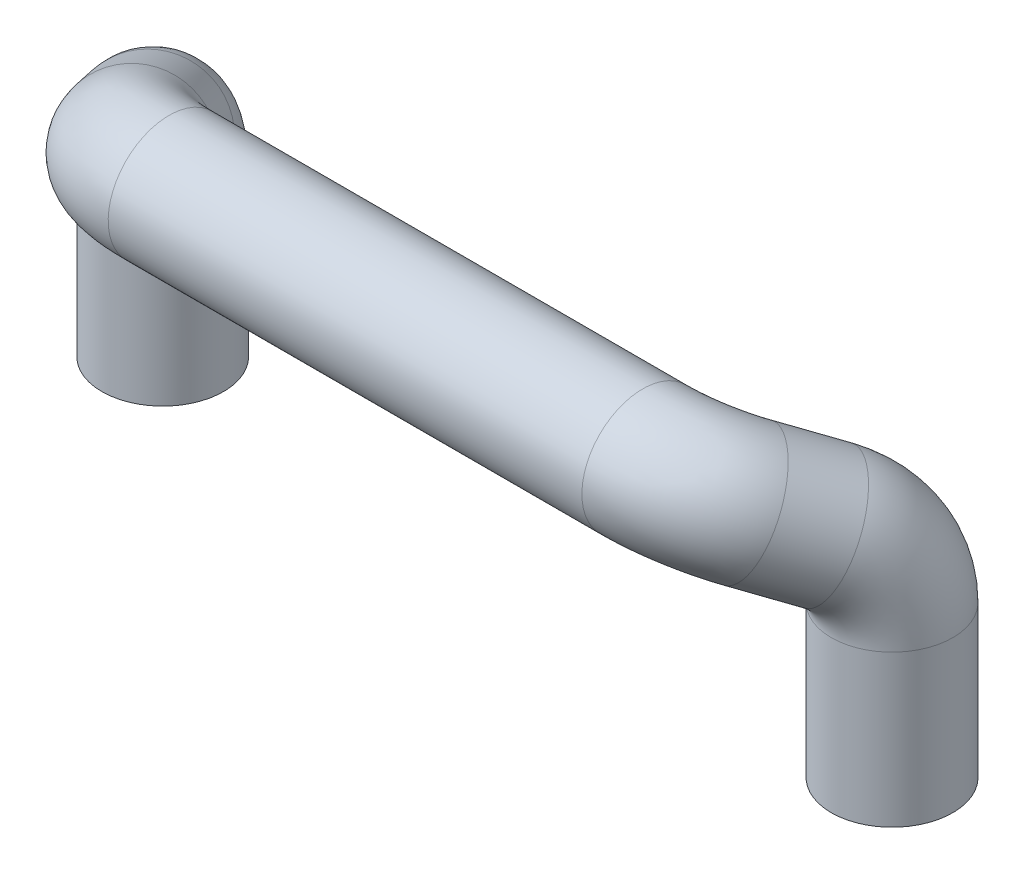
ISO-10303-21;
HEADER;
FILE_DESCRIPTION(('STEP AP214'),'2;1');
FILE_NAME('part.step','',(''),(''),'','','');
FILE_SCHEMA(('AUTOMOTIVE_DESIGN { 1 0 10303 214 1 1 1 1 }'));
ENDSEC;
DATA;
#1=APPLICATION_CONTEXT('core data for automotive mechanical design processes');
#2=APPLICATION_PROTOCOL_DEFINITION('international standard','automotive_design',2000,#1);
#3=PRODUCT_CONTEXT('',#1,'mechanical');
#4=PRODUCT('Part','Part','',(#3));
#5=PRODUCT_RELATED_PRODUCT_CATEGORY('part','',(#4));
#6=PRODUCT_DEFINITION_FORMATION('','',#4);
#7=PRODUCT_DEFINITION_CONTEXT('part definition',#1,'design');
#8=PRODUCT_DEFINITION('design','',#6,#7);
#9=PRODUCT_DEFINITION_SHAPE('','',#8);
#10=(LENGTH_UNIT() NAMED_UNIT(*) SI_UNIT(.MILLI.,.METRE.));
#11=(NAMED_UNIT(*) PLANE_ANGLE_UNIT() SI_UNIT($,.RADIAN.));
#12=(NAMED_UNIT(*) SI_UNIT($,.STERADIAN.) SOLID_ANGLE_UNIT());
#13=UNCERTAINTY_MEASURE_WITH_UNIT(LENGTH_MEASURE(1.E-05),#10,'distance_accuracy_value','');
#14=(GEOMETRIC_REPRESENTATION_CONTEXT(3) GLOBAL_UNCERTAINTY_ASSIGNED_CONTEXT((#13)) GLOBAL_UNIT_ASSIGNED_CONTEXT((#10,
#11,#12)) REPRESENTATION_CONTEXT('',''));
#15=CARTESIAN_POINT('',(0.,0.,0.));
#16=DIRECTION('',(0.,0.,1.));
#17=DIRECTION('',(1.,0.,0.));
#18=AXIS2_PLACEMENT_3D('',#15,#16,#17);
#19=CARTESIAN_POINT('',(65.,-25.,0.));
#20=DIRECTION('',(0.,-1.,0.));
#21=DIRECTION('',(0.,0.,1.));
#22=AXIS2_PLACEMENT_3D('',#19,#20,#21);
#23=PLANE('',#22);
#24=CARTESIAN_POINT('',(65.,-25.,0.));
#25=DIRECTION('',(0.,-1.,0.));
#26=DIRECTION('',(0.,0.,1.));
#27=AXIS2_PLACEMENT_3D('',#24,#25,#26);
#28=CIRCLE('',#27,7.5);
#29=CARTESIAN_POINT('',(65.,-25.,7.49999999999999));
#30=VERTEX_POINT('',#29);
#31=EDGE_CURVE('E80',#30,#30,#28,.T.);
#32=ORIENTED_EDGE('',*,*,#31,.T.);
#33=EDGE_LOOP('',(#32));
#34=FACE_BOUND('',#33,.T.);
#35=ADVANCED_FACE('F46',(#34),#23,.T.);
#36=CARTESIAN_POINT('',(-25.,-25.,0.));
#37=DIRECTION('',(0.,1.,0.));
#38=DIRECTION('',(0.,0.,1.));
#39=AXIS2_PLACEMENT_3D('',#36,#37,#38);
#40=PLANE('',#39);
#41=CARTESIAN_POINT('',(-25.,-25.,0.));
#42=DIRECTION('',(0.,1.,0.));
#43=DIRECTION('',(0.,0.,1.));
#44=AXIS2_PLACEMENT_3D('',#41,#42,#43);
#45=CIRCLE('',#44,7.5);
#46=CARTESIAN_POINT('',(-25.,-25.,7.49999999999999));
#47=VERTEX_POINT('',#46);
#48=EDGE_CURVE('E11',#47,#47,#45,.T.);
#49=ORIENTED_EDGE('',*,*,#48,.F.);
#50=EDGE_LOOP('',(#49));
#51=FACE_BOUND('',#50,.T.);
#52=ADVANCED_FACE('F88',(#51),#40,.F.);
#53=CARTESIAN_POINT('',(65.,-25.,0.));
#54=DIRECTION('',(0.,1.,0.));
#55=DIRECTION('',(0.,0.,1.));
#56=AXIS2_PLACEMENT_3D('',#53,#54,#55);
#57=CYLINDRICAL_SURFACE('',#56,7.5);
#58=CARTESIAN_POINT('',(65.,-6.29015931035198,0.));
#59=DIRECTION('',(0.,-1.,0.));
#60=DIRECTION('',(0.,0.,1.));
#61=AXIS2_PLACEMENT_3D('',#58,#59,#60);
#62=CIRCLE('',#61,7.5);
#63=CARTESIAN_POINT('',(69.1602514716892,-6.29015931035198,-6.24037720753386));
#64=VERTEX_POINT('',#63);
#65=EDGE_CURVE('E77',#64,#64,#62,.T.);
#66=ORIENTED_EDGE('',*,*,#65,.T.);
#67=EDGE_LOOP('',(#66));
#68=FACE_BOUND('',#67,.T.);
#69=ORIENTED_EDGE('',*,*,#31,.F.);
#70=EDGE_LOOP('',(#69));
#71=FACE_BOUND('',#70,.T.);
#72=ADVANCED_FACE('F85',(#68,#71),#57,.T.);
#73=CARTESIAN_POINT('',(59.4529980377478,-6.29015931035198,8.32050294337845));
#74=DIRECTION('',(0.832050294337845,0.,0.554700196225228));
#75=DIRECTION('',(0.554700196225228,0.,-0.832050294337845));
#76=AXIS2_PLACEMENT_3D('',#73,#74,#75);
#77=TOROIDAL_SURFACE('',#76,10.,7.5);
#78=CARTESIAN_POINT('',(61.854920344824,2.723718878308,4.717619482764));
#79=DIRECTION('',(0.499999999999999,-0.433012701892218,-0.750000000000001));
#80=DIRECTION('',(0.261686445280513,-0.750000000000002,0.607470332079227));
#81=AXIS2_PLACEMENT_3D('',#78,#79,#80);
#82=CIRCLE('',#81,7.5);
#83=CARTESIAN_POINT('',(63.6563620751313,9.48412751980299,2.01545688730315));
#84=VERTEX_POINT('',#83);
#85=EDGE_CURVE('E74',#84,#84,#82,.T.);
#86=CARTESIAN_POINT('',(59.4529980377478,-6.29015931035198,8.32050294337845));
#87=DIRECTION('',(0.832050294337845,0.,0.554700196225228));
#88=DIRECTION('',(0.554700196225228,0.,-0.832050294337845));
#89=AXIS2_PLACEMENT_3D('',#86,#87,#88);
#90=CIRCLE('',#89,17.5);
#91=EDGE_CURVE('',#64,#84,#90,.T.);
#92=ORIENTED_EDGE('',*,*,#65,.F.);
#93=ORIENTED_EDGE('',*,*,#85,.T.);
#94=ORIENTED_EDGE('',*,*,#91,.T.);
#95=ORIENTED_EDGE('',*,*,#91,.F.);
#96=EDGE_LOOP('',(#92,#94,#93,#95));
#97=FACE_BOUND('',#96,.T.);
#98=ADVANCED_FACE('F87',(#97),#77,.T.);
#99=CARTESIAN_POINT('',(61.854920344824,2.723718878308,4.71761948276399));
#100=DIRECTION('',(-0.499999999999999,0.433012701892218,0.750000000000001));
#101=DIRECTION('',(0.832050294337844,0.,0.554700196225228));
#102=AXIS2_PLACEMENT_3D('',#99,#100,#101);
#103=CYLINDRICAL_SURFACE('',#102,7.5);
#104=CARTESIAN_POINT('',(57.8867513459481,6.16025403784441,10.6698729810779));
#105=DIRECTION('',(0.499999999999999,-0.433012701892218,-0.750000000000001));
#106=DIRECTION('',(0.261686445280513,-0.750000000000002,0.607470332079226));
#107=AXIS2_PLACEMENT_3D('',#104,#105,#106);
#108=CIRCLE('',#107,7.5);
#109=CARTESIAN_POINT('',(64.3819418743314,8.03525403784439,13.9174682452695));
#110=VERTEX_POINT('',#109);
#111=EDGE_CURVE('E71',#110,#110,#108,.T.);
#112=ORIENTED_EDGE('',*,*,#111,.T.);
#113=EDGE_LOOP('',(#112));
#114=FACE_BOUND('',#113,.T.);
#115=ORIENTED_EDGE('',*,*,#85,.F.);
#116=EDGE_LOOP('',(#115));
#117=FACE_BOUND('',#116,.T.);
#118=ADVANCED_FACE('F95',(#114,#117),#103,.T.);
#119=CARTESIAN_POINT('',(49.2264973081037,3.66025403784443,6.33974596215572));
#120=DIRECTION('',(0.,-0.866025403784439,0.499999999999998));
#121=DIRECTION('',(0.,-0.499999999999998,-0.86602540378444));
#122=AXIS2_PLACEMENT_3D('',#119,#120,#121);
#123=TOROIDAL_SURFACE('',#122,10.,7.5);
#124=CARTESIAN_POINT('',(49.2264973081037,8.6602540378444,15.0000000000001));
#125=DIRECTION('',(1.,0.,0.));
#126=DIRECTION('',(0.,-0.674457630187012,0.738313554719483));
#127=AXIS2_PLACEMENT_3D('',#124,#125,#126);
#128=CIRCLE('',#127,7.5);
#129=CARTESIAN_POINT('',(49.2264973081037,12.4102540378444,21.4951905283834));
#130=VERTEX_POINT('',#129);
#131=EDGE_CURVE('E68',#130,#130,#128,.T.);
#132=CARTESIAN_POINT('',(49.2264973081037,3.66025403784443,6.33974596215572));
#133=DIRECTION('',(0.,-0.866025403784439,0.499999999999998));
#134=DIRECTION('',(0.,-0.499999999999998,-0.86602540378444));
#135=AXIS2_PLACEMENT_3D('',#132,#133,#134);
#136=CIRCLE('',#135,17.5);
#137=EDGE_CURVE('',#110,#130,#136,.T.);
#138=ORIENTED_EDGE('',*,*,#111,.F.);
#139=ORIENTED_EDGE('',*,*,#131,.T.);
#140=ORIENTED_EDGE('',*,*,#137,.T.);
#141=ORIENTED_EDGE('',*,*,#137,.F.);
#142=EDGE_LOOP('',(#138,#140,#139,#141));
#143=FACE_BOUND('',#142,.T.);
#144=ADVANCED_FACE('F120',(#143),#123,.T.);
#145=CARTESIAN_POINT('',(49.2264973081037,8.6602540378444,15.0000000000001));
#146=DIRECTION('',(-1.,0.,0.));
#147=DIRECTION('',(0.,0.,1.));
#148=AXIS2_PLACEMENT_3D('',#145,#146,#147);
#149=CYLINDRICAL_SURFACE('',#148,7.5);
#150=CARTESIAN_POINT('',(-9.22649730810374,8.6602540378444,15.0000000000001));
#151=DIRECTION('',(1.,0.,0.));
#152=DIRECTION('',(0.,-0.674457630187012,0.738313554719483));
#153=AXIS2_PLACEMENT_3D('',#150,#151,#152);
#154=CIRCLE('',#153,7.5);
#155=CARTESIAN_POINT('',(-9.22649730810375,12.4102540378444,21.4951905283834));
#156=VERTEX_POINT('',#155);
#157=EDGE_CURVE('E65',#156,#156,#154,.T.);
#158=ORIENTED_EDGE('',*,*,#157,.T.);
#159=EDGE_LOOP('',(#158));
#160=FACE_BOUND('',#159,.T.);
#161=ORIENTED_EDGE('',*,*,#131,.F.);
#162=EDGE_LOOP('',(#161));
#163=FACE_BOUND('',#162,.T.);
#164=ADVANCED_FACE('F116',(#160,#163),#149,.T.);
#165=CARTESIAN_POINT('',(-9.22649730810373,3.66025403784442,6.33974596215569));
#166=DIRECTION('',(0.,-0.86602540378444,0.499999999999998));
#167=DIRECTION('',(0.,-0.499999999999998,-0.86602540378444));
#168=AXIS2_PLACEMENT_3D('',#165,#166,#167);
#169=TOROIDAL_SURFACE('',#168,10.,7.5);
#170=CARTESIAN_POINT('',(-17.8867513459481,6.1602540378444,10.6698729810779));
#171=DIRECTION('',(0.499999999999998,0.433012701892218,0.750000000000002));
#172=DIRECTION('',(-0.261686445280513,-0.750000000000002,0.607470332079226));
#173=AXIS2_PLACEMENT_3D('',#170,#171,#172);
#174=CIRCLE('',#173,7.5);
#175=CARTESIAN_POINT('',(-24.3819418743314,8.03525403784438,13.9174682452695));
#176=VERTEX_POINT('',#175);
#177=EDGE_CURVE('E60',#176,#176,#174,.T.);
#178=CARTESIAN_POINT('',(-9.22649730810373,3.66025403784442,6.33974596215569));
#179=DIRECTION('',(0.,-0.86602540378444,0.499999999999998));
#180=DIRECTION('',(0.,-0.499999999999998,-0.86602540378444));
#181=AXIS2_PLACEMENT_3D('',#178,#179,#180);
#182=CIRCLE('',#181,17.5);
#183=EDGE_CURVE('',#156,#176,#182,.T.);
#184=ORIENTED_EDGE('',*,*,#157,.F.);
#185=ORIENTED_EDGE('',*,*,#177,.T.);
#186=ORIENTED_EDGE('',*,*,#183,.T.);
#187=ORIENTED_EDGE('',*,*,#183,.F.);
#188=EDGE_LOOP('',(#184,#186,#185,#187));
#189=FACE_BOUND('',#188,.T.);
#190=ADVANCED_FACE('F112',(#189),#169,.T.);
#191=CARTESIAN_POINT('',(-17.8867513459481,6.1602540378444,10.6698729810779));
#192=DIRECTION('',(-0.499999999999997,-0.433012701892219,-0.750000000000002));
#193=DIRECTION('',(-0.832050294337846,0.,0.554700196225226));
#194=AXIS2_PLACEMENT_3D('',#191,#192,#193);
#195=CYLINDRICAL_SURFACE('',#194,7.5);
#196=CARTESIAN_POINT('',(-21.854920344824,2.72371887830799,4.71761948276397));
#197=DIRECTION('',(0.499999999999997,0.433012701892219,0.750000000000002));
#198=DIRECTION('',(-0.261686445280513,-0.750000000000002,0.607470332079226));
#199=AXIS2_PLACEMENT_3D('',#196,#197,#198);
#200=CIRCLE('',#199,7.5);
#201=CARTESIAN_POINT('',(-23.6563620751312,9.48412751980297,2.01545688730311));
#202=VERTEX_POINT('',#201);
#203=EDGE_CURVE('E56',#202,#202,#200,.T.);
#204=ORIENTED_EDGE('',*,*,#203,.T.);
#205=EDGE_LOOP('',(#204));
#206=FACE_BOUND('',#205,.T.);
#207=ORIENTED_EDGE('',*,*,#177,.F.);
#208=EDGE_LOOP('',(#207));
#209=FACE_BOUND('',#208,.T.);
#210=ADVANCED_FACE('F106',(#206,#209),#195,.T.);
#211=CARTESIAN_POINT('',(-19.4529980377477,-6.29015931035198,8.32050294337845));
#212=DIRECTION('',(-0.832050294337845,0.,0.554700196225226));
#213=DIRECTION('',(0.554700196225226,0.,0.832050294337845));
#214=AXIS2_PLACEMENT_3D('',#211,#212,#213);
#215=TOROIDAL_SURFACE('',#214,10.,7.5);
#216=CARTESIAN_POINT('',(-25.,-6.29015931035198,0.));
#217=DIRECTION('',(0.,1.,0.));
#218=DIRECTION('',(0.,0.,1.));
#219=AXIS2_PLACEMENT_3D('',#216,#217,#218);
#220=CIRCLE('',#219,7.5);
#221=CARTESIAN_POINT('',(-29.1602514716892,-6.29015931035198,-6.24037720753384));
#222=VERTEX_POINT('',#221);
#223=EDGE_CURVE('E52',#222,#222,#220,.T.);
#224=CARTESIAN_POINT('',(-19.4529980377477,-6.29015931035198,8.32050294337845));
#225=DIRECTION('',(-0.832050294337845,0.,0.554700196225226));
#226=DIRECTION('',(0.554700196225226,0.,0.832050294337845));
#227=AXIS2_PLACEMENT_3D('',#224,#225,#226);
#228=CIRCLE('',#227,17.5);
#229=EDGE_CURVE('',#202,#222,#228,.T.);
#230=ORIENTED_EDGE('',*,*,#203,.F.);
#231=ORIENTED_EDGE('',*,*,#223,.T.);
#232=ORIENTED_EDGE('',*,*,#229,.T.);
#233=ORIENTED_EDGE('',*,*,#229,.F.);
#234=EDGE_LOOP('',(#230,#232,#231,#233));
#235=FACE_BOUND('',#234,.T.);
#236=ADVANCED_FACE('F101',(#235),#215,.T.);
#237=CARTESIAN_POINT('',(-25.,-6.29015931035198,0.));
#238=DIRECTION('',(0.,-1.,0.));
#239=DIRECTION('',(0.,0.,-1.));
#240=AXIS2_PLACEMENT_3D('',#237,#238,#239);
#241=CYLINDRICAL_SURFACE('',#240,7.5);
#242=ORIENTED_EDGE('',*,*,#48,.T.);
#243=EDGE_LOOP('',(#242));
#244=FACE_BOUND('',#243,.T.);
#245=ORIENTED_EDGE('',*,*,#223,.F.);
#246=EDGE_LOOP('',(#245));
#247=FACE_BOUND('',#246,.T.);
#248=ADVANCED_FACE('F99',(#244,#247),#241,.T.);
#249=CLOSED_SHELL('',(#35,#52,#72,#98,#118,#144,#164,#190,#210,#236,#248));
#250=MANIFOLD_SOLID_BREP('B2',#249);
#251=ADVANCED_BREP_SHAPE_REPRESENTATION('',(#18,#250),#14);
#252=SHAPE_DEFINITION_REPRESENTATION(#9,#251);
ENDSEC;
END-ISO-10303-21;
